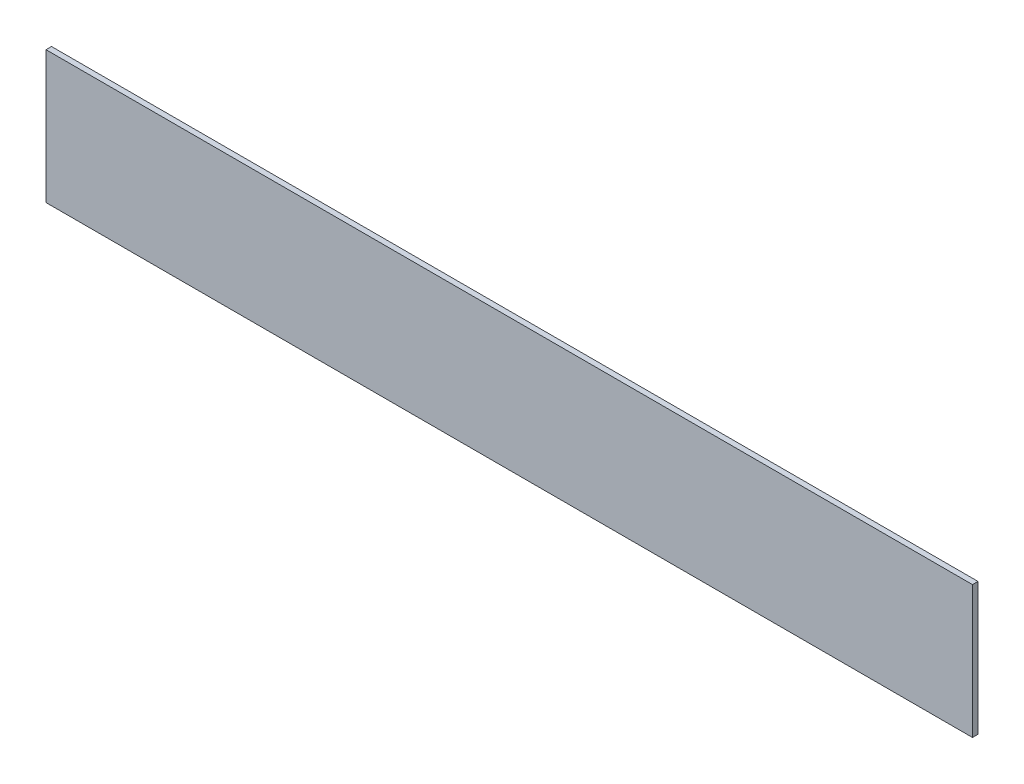
ISO-10303-21;
HEADER;
FILE_DESCRIPTION(('STEP AP214'),'2;1');
FILE_NAME('part.step','',(''),(''),'','','');
FILE_SCHEMA(('AUTOMOTIVE_DESIGN { 1 0 10303 214 1 1 1 1 }'));
ENDSEC;
DATA;
#1=APPLICATION_CONTEXT('core data for automotive mechanical design processes');
#2=APPLICATION_PROTOCOL_DEFINITION('international standard','automotive_design',2000,#1);
#3=PRODUCT_CONTEXT('',#1,'mechanical');
#4=PRODUCT('Part','Part','',(#3));
#5=PRODUCT_RELATED_PRODUCT_CATEGORY('part','',(#4));
#6=PRODUCT_DEFINITION_FORMATION('','',#4);
#7=PRODUCT_DEFINITION_CONTEXT('part definition',#1,'design');
#8=PRODUCT_DEFINITION('design','',#6,#7);
#9=PRODUCT_DEFINITION_SHAPE('','',#8);
#10=(LENGTH_UNIT() NAMED_UNIT(*) SI_UNIT(.MILLI.,.METRE.));
#11=(NAMED_UNIT(*) PLANE_ANGLE_UNIT() SI_UNIT($,.RADIAN.));
#12=(NAMED_UNIT(*) SI_UNIT($,.STERADIAN.) SOLID_ANGLE_UNIT());
#13=UNCERTAINTY_MEASURE_WITH_UNIT(LENGTH_MEASURE(1.E-05),#10,'distance_accuracy_value','');
#14=(GEOMETRIC_REPRESENTATION_CONTEXT(3) GLOBAL_UNCERTAINTY_ASSIGNED_CONTEXT((#13)) GLOBAL_UNIT_ASSIGNED_CONTEXT((#10,
#11,#12)) REPRESENTATION_CONTEXT('',''));
#15=CARTESIAN_POINT('',(0.,0.,0.));
#16=DIRECTION('',(0.,0.,1.));
#17=DIRECTION('',(1.,0.,0.));
#18=AXIS2_PLACEMENT_3D('',#15,#16,#17);
#19=CARTESIAN_POINT('',(-247.204603891019,6281.90722402998,3.17499999999996));
#20=DIRECTION('',(1.,0.,0.));
#21=DIRECTION('',(0.,0.,-1.));
#22=AXIS2_PLACEMENT_3D('',#19,#20,#21);
#23=PLANE('',#22);
#24=DIRECTION('',(0.,-1.,0.));
#25=VECTOR('',#24,1.);
#26=CARTESIAN_POINT('',(-247.204603891019,6281.90722402998,0.));
#27=LINE('',#26,#25);
#28=CARTESIAN_POINT('',(-247.204603891019,6281.90722402998,0.));
#29=VERTEX_POINT('',#28);
#30=CARTESIAN_POINT('',(-247.204603891019,6205.70722402998,0.));
#31=VERTEX_POINT('',#30);
#32=EDGE_CURVE('E97',#29,#31,#27,.T.);
#33=ORIENTED_EDGE('',*,*,#32,.T.);
#34=DIRECTION('',(0.,0.,-1.));
#35=VECTOR('',#34,1.);
#36=CARTESIAN_POINT('',(-247.204603891019,6205.70722402998,3.17499999999996));
#37=LINE('',#36,#35);
#38=CARTESIAN_POINT('',(-247.204603891019,6205.70722402998,3.17499999999996));
#39=VERTEX_POINT('',#38);
#40=EDGE_CURVE('E11',#39,#31,#37,.T.);
#41=ORIENTED_EDGE('',*,*,#40,.F.);
#42=DIRECTION('',(0.,-1.,0.));
#43=VECTOR('',#42,1.);
#44=CARTESIAN_POINT('',(-247.204603891019,6281.90722402998,3.17499999999996));
#45=LINE('',#44,#43);
#46=CARTESIAN_POINT('',(-247.204603891019,6281.90722402998,3.17499999999996));
#47=VERTEX_POINT('',#46);
#48=EDGE_CURVE('E85',#47,#39,#45,.T.);
#49=ORIENTED_EDGE('',*,*,#48,.F.);
#50=DIRECTION('',(0.,0.,-1.));
#51=VECTOR('',#50,1.);
#52=CARTESIAN_POINT('',(-247.204603891019,6281.90722402998,3.17499999999996));
#53=LINE('',#52,#51);
#54=EDGE_CURVE('E93',#47,#29,#53,.T.);
#55=ORIENTED_EDGE('',*,*,#54,.T.);
#56=EDGE_LOOP('',(#33,#41,#49,#55));
#57=FACE_BOUND('',#56,.T.);
#58=ADVANCED_FACE('F34',(#57),#23,.F.);
#59=CARTESIAN_POINT('',(-247.204603891019,6205.70722402998,3.17499999999996));
#60=DIRECTION('',(0.,1.,0.));
#61=DIRECTION('',(0.,0.,1.));
#62=AXIS2_PLACEMENT_3D('',#59,#60,#61);
#63=PLANE('',#62);
#64=DIRECTION('',(1.,0.,0.));
#65=VECTOR('',#64,1.);
#66=CARTESIAN_POINT('',(-247.204603891019,6205.70722402998,0.));
#67=LINE('',#66,#65);
#68=CARTESIAN_POINT('',(285.941396108981,6205.70722402998,0.));
#69=VERTEX_POINT('',#68);
#70=EDGE_CURVE('E89',#31,#69,#67,.T.);
#71=ORIENTED_EDGE('',*,*,#70,.T.);
#72=DIRECTION('',(0.,0.,-1.));
#73=VECTOR('',#72,1.);
#74=CARTESIAN_POINT('',(285.941396108981,6205.70722402998,3.17499999999996));
#75=LINE('',#74,#73);
#76=CARTESIAN_POINT('',(285.941396108981,6205.70722402998,3.17499999999996));
#77=VERTEX_POINT('',#76);
#78=EDGE_CURVE('E42',#77,#69,#75,.T.);
#79=ORIENTED_EDGE('',*,*,#78,.F.);
#80=DIRECTION('',(1.,0.,0.));
#81=VECTOR('',#80,1.);
#82=CARTESIAN_POINT('',(-247.204603891019,6205.70722402998,3.17499999999996));
#83=LINE('',#82,#81);
#84=EDGE_CURVE('E80',#39,#77,#83,.T.);
#85=ORIENTED_EDGE('',*,*,#84,.F.);
#86=ORIENTED_EDGE('',*,*,#40,.T.);
#87=EDGE_LOOP('',(#71,#79,#85,#86));
#88=FACE_BOUND('',#87,.T.);
#89=ADVANCED_FACE('F88',(#88),#63,.F.);
#90=CARTESIAN_POINT('',(285.941396108981,6281.90722402998,3.17499999999996));
#91=DIRECTION('',(-1.,0.,0.));
#92=DIRECTION('',(0.,0.,1.));
#93=AXIS2_PLACEMENT_3D('',#90,#91,#92);
#94=PLANE('',#93);
#95=DIRECTION('',(0.,1.,0.));
#96=VECTOR('',#95,1.);
#97=CARTESIAN_POINT('',(285.941396108981,6281.90722402998,0.));
#98=LINE('',#97,#96);
#99=CARTESIAN_POINT('',(285.941396108981,6281.90722402998,0.));
#100=VERTEX_POINT('',#99);
#101=EDGE_CURVE('E67',#69,#100,#98,.T.);
#102=ORIENTED_EDGE('',*,*,#101,.T.);
#103=DIRECTION('',(0.,0.,-1.));
#104=VECTOR('',#103,1.);
#105=CARTESIAN_POINT('',(285.941396108981,6281.90722402998,3.17499999999996));
#106=LINE('',#105,#104);
#107=CARTESIAN_POINT('',(285.941396108981,6281.90722402998,3.17499999999996));
#108=VERTEX_POINT('',#107);
#109=EDGE_CURVE('E90',#108,#100,#106,.T.);
#110=ORIENTED_EDGE('',*,*,#109,.F.);
#111=DIRECTION('',(0.,1.,0.));
#112=VECTOR('',#111,1.);
#113=CARTESIAN_POINT('',(285.941396108981,6281.90722402998,3.17499999999996));
#114=LINE('',#113,#112);
#115=EDGE_CURVE('E83',#77,#108,#114,.T.);
#116=ORIENTED_EDGE('',*,*,#115,.F.);
#117=ORIENTED_EDGE('',*,*,#78,.T.);
#118=EDGE_LOOP('',(#102,#110,#116,#117));
#119=FACE_BOUND('',#118,.T.);
#120=ADVANCED_FACE('F91',(#119),#94,.F.);
#121=CARTESIAN_POINT('',(-247.204603891019,6281.90722402998,3.17499999999996));
#122=DIRECTION('',(0.,-1.,0.));
#123=DIRECTION('',(0.,0.,-1.));
#124=AXIS2_PLACEMENT_3D('',#121,#122,#123);
#125=PLANE('',#124);
#126=DIRECTION('',(-1.,0.,0.));
#127=VECTOR('',#126,1.);
#128=CARTESIAN_POINT('',(-247.204603891019,6281.90722402998,0.));
#129=LINE('',#128,#127);
#130=EDGE_CURVE('E73',#100,#29,#129,.T.);
#131=ORIENTED_EDGE('',*,*,#130,.T.);
#132=ORIENTED_EDGE('',*,*,#54,.F.);
#133=DIRECTION('',(-1.,0.,0.));
#134=VECTOR('',#133,1.);
#135=CARTESIAN_POINT('',(-247.204603891019,6281.90722402998,3.17499999999996));
#136=LINE('',#135,#134);
#137=EDGE_CURVE('E50',#108,#47,#136,.T.);
#138=ORIENTED_EDGE('',*,*,#137,.F.);
#139=ORIENTED_EDGE('',*,*,#109,.T.);
#140=EDGE_LOOP('',(#131,#132,#138,#139));
#141=FACE_BOUND('',#140,.T.);
#142=ADVANCED_FACE('F104',(#141),#125,.F.);
#143=CARTESIAN_POINT('',(0.,0.,3.17499999999996));
#144=DIRECTION('',(0.,0.,1.));
#145=DIRECTION('',(1.,0.,0.));
#146=AXIS2_PLACEMENT_3D('',#143,#144,#145);
#147=PLANE('',#146);
#148=ORIENTED_EDGE('',*,*,#48,.T.);
#149=ORIENTED_EDGE('',*,*,#84,.T.);
#150=ORIENTED_EDGE('',*,*,#115,.T.);
#151=ORIENTED_EDGE('',*,*,#137,.T.);
#152=EDGE_LOOP('',(#148,#149,#150,#151));
#153=FACE_BOUND('',#152,.T.);
#154=ADVANCED_FACE('F81',(#153),#147,.T.);
#155=CARTESIAN_POINT('',(0.,0.,0.));
#156=DIRECTION('',(0.,0.,1.));
#157=DIRECTION('',(1.,0.,0.));
#158=AXIS2_PLACEMENT_3D('',#155,#156,#157);
#159=PLANE('',#158);
#160=ORIENTED_EDGE('',*,*,#32,.F.);
#161=ORIENTED_EDGE('',*,*,#130,.F.);
#162=ORIENTED_EDGE('',*,*,#101,.F.);
#163=ORIENTED_EDGE('',*,*,#70,.F.);
#164=EDGE_LOOP('',(#160,#161,#162,#163));
#165=FACE_BOUND('',#164,.T.);
#166=ADVANCED_FACE('F107',(#165),#159,.F.);
#167=CLOSED_SHELL('',(#58,#89,#120,#142,#154,#166));
#168=MANIFOLD_SOLID_BREP('B2',#167);
#169=ADVANCED_BREP_SHAPE_REPRESENTATION('',(#18,#168),#14);
#170=SHAPE_DEFINITION_REPRESENTATION(#9,#169);
ENDSEC;
END-ISO-10303-21;
